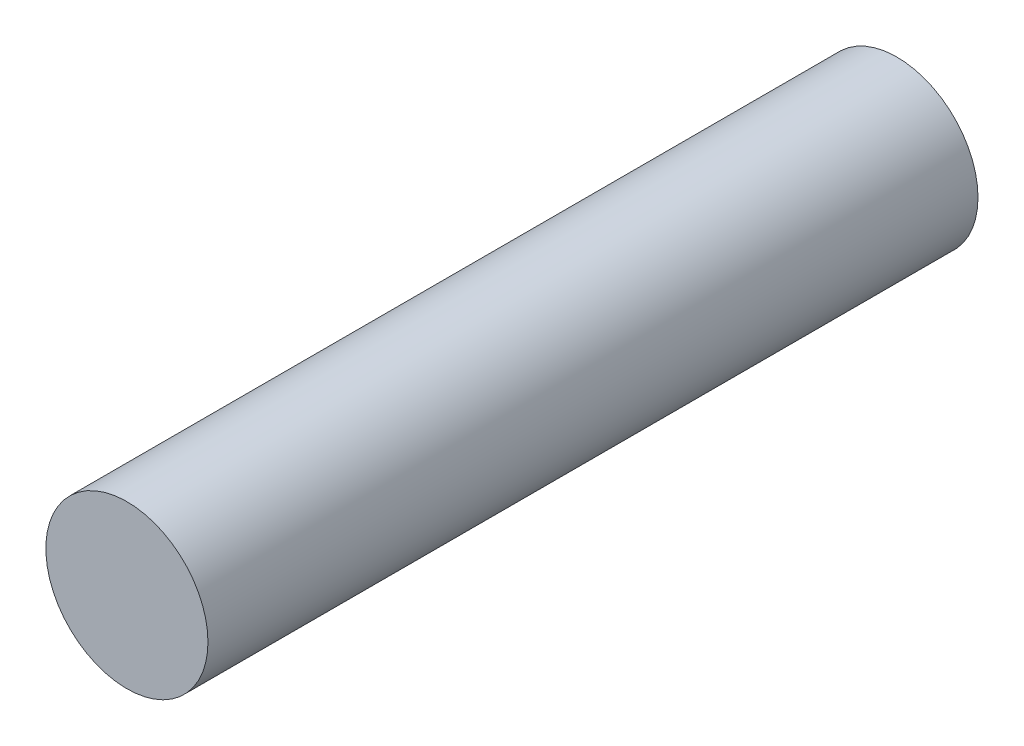
ISO-10303-21;
HEADER;
FILE_DESCRIPTION(('STEP AP214'),'2;1');
FILE_NAME('part.step','',(''),(''),'','','');
FILE_SCHEMA(('AUTOMOTIVE_DESIGN { 1 0 10303 214 1 1 1 1 }'));
ENDSEC;
DATA;
#1=APPLICATION_CONTEXT('core data for automotive mechanical design processes');
#2=APPLICATION_PROTOCOL_DEFINITION('international standard','automotive_design',2000,#1);
#3=PRODUCT_CONTEXT('',#1,'mechanical');
#4=PRODUCT('Part','Part','',(#3));
#5=PRODUCT_RELATED_PRODUCT_CATEGORY('part','',(#4));
#6=PRODUCT_DEFINITION_FORMATION('','',#4);
#7=PRODUCT_DEFINITION_CONTEXT('part definition',#1,'design');
#8=PRODUCT_DEFINITION('design','',#6,#7);
#9=PRODUCT_DEFINITION_SHAPE('','',#8);
#10=(LENGTH_UNIT() NAMED_UNIT(*) SI_UNIT(.MILLI.,.METRE.));
#11=(NAMED_UNIT(*) PLANE_ANGLE_UNIT() SI_UNIT($,.RADIAN.));
#12=(NAMED_UNIT(*) SI_UNIT($,.STERADIAN.) SOLID_ANGLE_UNIT());
#13=UNCERTAINTY_MEASURE_WITH_UNIT(LENGTH_MEASURE(1.E-05),#10,'distance_accuracy_value','');
#14=(GEOMETRIC_REPRESENTATION_CONTEXT(3) GLOBAL_UNCERTAINTY_ASSIGNED_CONTEXT((#13)) GLOBAL_UNIT_ASSIGNED_CONTEXT((#10,
#11,#12)) REPRESENTATION_CONTEXT('',''));
#15=CARTESIAN_POINT('',(0.,0.,0.));
#16=DIRECTION('',(0.,0.,1.));
#17=DIRECTION('',(1.,0.,0.));
#18=AXIS2_PLACEMENT_3D('',#15,#16,#17);
#19=CARTESIAN_POINT('',(0.,0.,95.));
#20=DIRECTION('',(0.,0.,-1.));
#21=DIRECTION('',(-1.,0.,0.));
#22=AXIS2_PLACEMENT_3D('',#19,#20,#21);
#23=CYLINDRICAL_SURFACE('',#22,10.);
#24=CARTESIAN_POINT('',(0.,0.,95.));
#25=DIRECTION('',(0.,0.,1.));
#26=DIRECTION('',(1.,0.,0.));
#27=AXIS2_PLACEMENT_3D('',#24,#25,#26);
#28=CIRCLE('',#27,10.);
#29=CARTESIAN_POINT('',(10.,0.,95.));
#30=VERTEX_POINT('',#29);
#31=EDGE_CURVE('E10',#30,#30,#28,.T.);
#32=ORIENTED_EDGE('',*,*,#31,.F.);
#33=EDGE_LOOP('',(#32));
#34=FACE_BOUND('',#33,.T.);
#35=CARTESIAN_POINT('',(0.,0.,0.));
#36=DIRECTION('',(0.,0.,1.));
#37=DIRECTION('',(1.,0.,0.));
#38=AXIS2_PLACEMENT_3D('',#35,#36,#37);
#39=CIRCLE('',#38,10.);
#40=CARTESIAN_POINT('',(10.,0.,0.));
#41=VERTEX_POINT('',#40);
#42=EDGE_CURVE('E42',#41,#41,#39,.T.);
#43=ORIENTED_EDGE('',*,*,#42,.T.);
#44=EDGE_LOOP('',(#43));
#45=FACE_BOUND('',#44,.T.);
#46=ADVANCED_FACE('F39',(#34,#45),#23,.T.);
#47=CARTESIAN_POINT('',(0.,0.,95.));
#48=DIRECTION('',(0.,0.,1.));
#49=DIRECTION('',(1.,0.,0.));
#50=AXIS2_PLACEMENT_3D('',#47,#48,#49);
#51=PLANE('',#50);
#52=ORIENTED_EDGE('',*,*,#31,.T.);
#53=EDGE_LOOP('',(#52));
#54=FACE_BOUND('',#53,.T.);
#55=ADVANCED_FACE('F54',(#54),#51,.T.);
#56=CARTESIAN_POINT('',(0.,0.,0.));
#57=DIRECTION('',(0.,0.,1.));
#58=DIRECTION('',(1.,0.,0.));
#59=AXIS2_PLACEMENT_3D('',#56,#57,#58);
#60=PLANE('',#59);
#61=ORIENTED_EDGE('',*,*,#42,.F.);
#62=EDGE_LOOP('',(#61));
#63=FACE_BOUND('',#62,.T.);
#64=ADVANCED_FACE('F52',(#63),#60,.F.);
#65=CLOSED_SHELL('',(#46,#55,#64));
#66=MANIFOLD_SOLID_BREP('B2',#65);
#67=ADVANCED_BREP_SHAPE_REPRESENTATION('',(#18,#66),#14);
#68=SHAPE_DEFINITION_REPRESENTATION(#9,#67);
ENDSEC;
END-ISO-10303-21;
